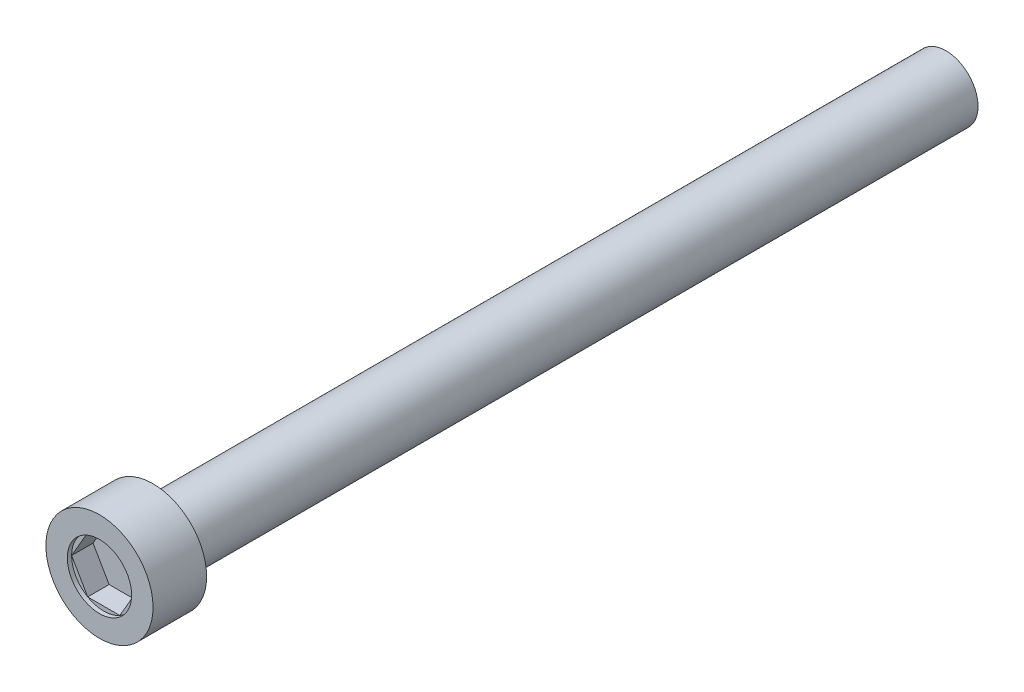
ISO-10303-21;
HEADER;
FILE_DESCRIPTION(('STEP AP214'),'2;1');
FILE_NAME('part.step','',(''),(''),'','','');
FILE_SCHEMA(('AUTOMOTIVE_DESIGN { 1 0 10303 214 1 1 1 1 }'));
ENDSEC;
DATA;
#1=APPLICATION_CONTEXT('core data for automotive mechanical design processes');
#2=APPLICATION_PROTOCOL_DEFINITION('international standard','automotive_design',2000,#1);
#3=PRODUCT_CONTEXT('',#1,'mechanical');
#4=PRODUCT('Part','Part','',(#3));
#5=PRODUCT_RELATED_PRODUCT_CATEGORY('part','',(#4));
#6=PRODUCT_DEFINITION_FORMATION('','',#4);
#7=PRODUCT_DEFINITION_CONTEXT('part definition',#1,'design');
#8=PRODUCT_DEFINITION('design','',#6,#7);
#9=PRODUCT_DEFINITION_SHAPE('','',#8);
#10=(LENGTH_UNIT() NAMED_UNIT(*) SI_UNIT(.MILLI.,.METRE.));
#11=(NAMED_UNIT(*) PLANE_ANGLE_UNIT() SI_UNIT($,.RADIAN.));
#12=(NAMED_UNIT(*) SI_UNIT($,.STERADIAN.) SOLID_ANGLE_UNIT());
#13=UNCERTAINTY_MEASURE_WITH_UNIT(LENGTH_MEASURE(1.E-05),#10,'distance_accuracy_value','');
#14=(GEOMETRIC_REPRESENTATION_CONTEXT(3) GLOBAL_UNCERTAINTY_ASSIGNED_CONTEXT((#13)) GLOBAL_UNIT_ASSIGNED_CONTEXT((#10,
#11,#12)) REPRESENTATION_CONTEXT('',''));
#15=CARTESIAN_POINT('',(0.,0.,0.));
#16=DIRECTION('',(0.,0.,1.));
#17=DIRECTION('',(1.,0.,0.));
#18=AXIS2_PLACEMENT_3D('',#15,#16,#17);
#19=CARTESIAN_POINT('',(0.,0.,1.3));
#20=DIRECTION('',(0.,0.,1.));
#21=DIRECTION('',(1.,0.,0.));
#22=AXIS2_PLACEMENT_3D('',#19,#20,#21);
#23=PLANE('',#22);
#24=DIRECTION('',(-0.5,-0.866025403784438,0.));
#25=VECTOR('',#24,1.);
#26=CARTESIAN_POINT('',(-0.749999999999999,1.29903810567666,1.3));
#27=LINE('',#26,#25);
#28=CARTESIAN_POINT('',(-0.749999999999999,1.29903810567666,1.3));
#29=VERTEX_POINT('',#28);
#30=CARTESIAN_POINT('',(-1.5,0.,1.3));
#31=VERTEX_POINT('',#30);
#32=EDGE_CURVE('E94',#29,#31,#27,.T.);
#33=ORIENTED_EDGE('',*,*,#32,.T.);
#34=DIRECTION('',(0.5,-0.866025403784439,0.));
#35=VECTOR('',#34,1.);
#36=CARTESIAN_POINT('',(-1.5,0.,1.3));
#37=LINE('',#36,#35);
#38=CARTESIAN_POINT('',(-0.75,-1.29903810567666,1.3));
#39=VERTEX_POINT('',#38);
#40=EDGE_CURVE('E157',#31,#39,#37,.T.);
#41=ORIENTED_EDGE('',*,*,#40,.T.);
#42=DIRECTION('',(1.,0.,0.));
#43=VECTOR('',#42,1.);
#44=CARTESIAN_POINT('',(-0.75,-1.29903810567666,1.3));
#45=LINE('',#44,#43);
#46=CARTESIAN_POINT('',(0.75,-1.29903810567666,1.3));
#47=VERTEX_POINT('',#46);
#48=EDGE_CURVE('E66',#39,#47,#45,.T.);
#49=ORIENTED_EDGE('',*,*,#48,.T.);
#50=DIRECTION('',(0.5,0.866025403784438,0.));
#51=VECTOR('',#50,1.);
#52=CARTESIAN_POINT('',(0.75,-1.29903810567666,1.3));
#53=LINE('',#52,#51);
#54=CARTESIAN_POINT('',(1.5,0.,1.3));
#55=VERTEX_POINT('',#54);
#56=EDGE_CURVE('E61',#47,#55,#53,.T.);
#57=ORIENTED_EDGE('',*,*,#56,.T.);
#58=DIRECTION('',(-0.5,0.866025403784439,0.));
#59=VECTOR('',#58,1.);
#60=CARTESIAN_POINT('',(1.5,0.,1.3));
#61=LINE('',#60,#59);
#62=CARTESIAN_POINT('',(0.750000000000001,1.29903810567666,1.3));
#63=VERTEX_POINT('',#62);
#64=EDGE_CURVE('E75',#55,#63,#61,.T.);
#65=ORIENTED_EDGE('',*,*,#64,.T.);
#66=DIRECTION('',(-1.,0.,0.));
#67=VECTOR('',#66,1.);
#68=CARTESIAN_POINT('',(0.750000000000001,1.29903810567666,1.3));
#69=LINE('',#68,#67);
#70=EDGE_CURVE('E78',#63,#29,#69,.T.);
#71=ORIENTED_EDGE('',*,*,#70,.T.);
#72=EDGE_LOOP('',(#33,#41,#49,#57,#65,#71));
#73=FACE_BOUND('',#72,.T.);
#74=ADVANCED_FACE('F16',(#73),#23,.T.);
#75=CARTESIAN_POINT('',(1.5,0.,1.3));
#76=DIRECTION('',(0.866025403784439,0.5,0.));
#77=DIRECTION('',(-0.5,0.866025403784439,0.));
#78=AXIS2_PLACEMENT_3D('',#75,#76,#77);
#79=PLANE('',#78);
#80=DIRECTION('',(0.,0.,1.));
#81=VECTOR('',#80,1.);
#82=CARTESIAN_POINT('',(0.750000000000001,1.29903810567666,1.3));
#83=LINE('',#82,#81);
#84=CARTESIAN_POINT('',(0.75,1.29903810567666,2.3));
#85=VERTEX_POINT('',#84);
#86=EDGE_CURVE('E80',#85,#63,#83,.F.);
#87=ORIENTED_EDGE('',*,*,#86,.T.);
#88=ORIENTED_EDGE('',*,*,#64,.F.);
#89=DIRECTION('',(0.,0.,1.));
#90=VECTOR('',#89,1.);
#91=CARTESIAN_POINT('',(1.5,0.,1.3));
#92=LINE('',#91,#90);
#93=CARTESIAN_POINT('',(1.5,0.,2.3));
#94=VERTEX_POINT('',#93);
#95=EDGE_CURVE('E53',#55,#94,#92,.T.);
#96=ORIENTED_EDGE('',*,*,#95,.T.);
#97=DIRECTION('',(0.499999999999999,-0.866025403784439,0.));
#98=VECTOR('',#97,1.);
#99=CARTESIAN_POINT('',(0.750000000000001,1.29903810567666,2.3));
#100=LINE('',#99,#98);
#101=EDGE_CURVE('E85',#85,#94,#100,.T.);
#102=ORIENTED_EDGE('',*,*,#101,.F.);
#103=EDGE_LOOP('',(#87,#88,#96,#102));
#104=FACE_BOUND('',#103,.T.);
#105=ADVANCED_FACE('F83',(#104),#79,.F.);
#106=CARTESIAN_POINT('',(0.750000000000001,1.29903810567666,1.3));
#107=DIRECTION('',(0.,1.,0.));
#108=DIRECTION('',(-1.,0.,0.));
#109=AXIS2_PLACEMENT_3D('',#106,#107,#108);
#110=PLANE('',#109);
#111=DIRECTION('',(0.,0.,1.));
#112=VECTOR('',#111,1.);
#113=CARTESIAN_POINT('',(-0.749999999999999,1.29903810567666,1.3));
#114=LINE('',#113,#112);
#115=CARTESIAN_POINT('',(-0.749999999999998,1.29903810567666,2.3));
#116=VERTEX_POINT('',#115);
#117=EDGE_CURVE('E91',#116,#29,#114,.F.);
#118=ORIENTED_EDGE('',*,*,#117,.T.);
#119=ORIENTED_EDGE('',*,*,#70,.F.);
#120=ORIENTED_EDGE('',*,*,#86,.F.);
#121=DIRECTION('',(1.,0.,0.));
#122=VECTOR('',#121,1.);
#123=CARTESIAN_POINT('',(0.,1.29903810567666,2.3));
#124=LINE('',#123,#122);
#125=EDGE_CURVE('E144',#116,#85,#124,.T.);
#126=ORIENTED_EDGE('',*,*,#125,.F.);
#127=EDGE_LOOP('',(#118,#119,#120,#126));
#128=FACE_BOUND('',#127,.T.);
#129=ADVANCED_FACE('F89',(#128),#110,.F.);
#130=CARTESIAN_POINT('',(-0.749999999999999,1.29903810567666,1.3));
#131=DIRECTION('',(-0.866025403784438,0.5,0.));
#132=DIRECTION('',(-0.5,-0.866025403784438,0.));
#133=AXIS2_PLACEMENT_3D('',#130,#131,#132);
#134=PLANE('',#133);
#135=DIRECTION('',(0.,0.,1.));
#136=VECTOR('',#135,1.);
#137=CARTESIAN_POINT('',(-1.5,0.,1.3));
#138=LINE('',#137,#136);
#139=CARTESIAN_POINT('',(-1.5,0.,2.3));
#140=VERTEX_POINT('',#139);
#141=EDGE_CURVE('E160',#140,#31,#138,.F.);
#142=ORIENTED_EDGE('',*,*,#141,.T.);
#143=ORIENTED_EDGE('',*,*,#32,.F.);
#144=ORIENTED_EDGE('',*,*,#117,.F.);
#145=DIRECTION('',(0.5,0.866025403784439,0.));
#146=VECTOR('',#145,1.);
#147=CARTESIAN_POINT('',(-1.5,0.,2.3));
#148=LINE('',#147,#146);
#149=EDGE_CURVE('E142',#140,#116,#148,.T.);
#150=ORIENTED_EDGE('',*,*,#149,.F.);
#151=EDGE_LOOP('',(#142,#143,#144,#150));
#152=FACE_BOUND('',#151,.T.);
#153=ADVANCED_FACE('F182',(#152),#134,.F.);
#154=CARTESIAN_POINT('',(-1.5,0.,1.3));
#155=DIRECTION('',(-0.866025403784439,-0.5,0.));
#156=DIRECTION('',(0.5,-0.866025403784439,0.));
#157=AXIS2_PLACEMENT_3D('',#154,#155,#156);
#158=PLANE('',#157);
#159=DIRECTION('',(0.,0.,1.));
#160=VECTOR('',#159,1.);
#161=CARTESIAN_POINT('',(-0.75,-1.29903810567666,1.3));
#162=LINE('',#161,#160);
#163=CARTESIAN_POINT('',(-0.749999999999999,-1.29903810567666,2.3));
#164=VERTEX_POINT('',#163);
#165=EDGE_CURVE('E154',#164,#39,#162,.F.);
#166=ORIENTED_EDGE('',*,*,#165,.T.);
#167=ORIENTED_EDGE('',*,*,#40,.F.);
#168=ORIENTED_EDGE('',*,*,#141,.F.);
#169=DIRECTION('',(-0.499999999999999,0.866025403784439,0.));
#170=VECTOR('',#169,1.);
#171=CARTESIAN_POINT('',(-0.75,-1.29903810567666,2.3));
#172=LINE('',#171,#170);
#173=EDGE_CURVE('E137',#164,#140,#172,.T.);
#174=ORIENTED_EDGE('',*,*,#173,.F.);
#175=EDGE_LOOP('',(#166,#167,#168,#174));
#176=FACE_BOUND('',#175,.T.);
#177=ADVANCED_FACE('F184',(#176),#158,.F.);
#178=CARTESIAN_POINT('',(-0.75,-1.29903810567666,1.3));
#179=DIRECTION('',(0.,-1.,0.));
#180=DIRECTION('',(1.,0.,0.));
#181=AXIS2_PLACEMENT_3D('',#178,#179,#180);
#182=PLANE('',#181);
#183=DIRECTION('',(0.,0.,1.));
#184=VECTOR('',#183,1.);
#185=CARTESIAN_POINT('',(0.75,-1.29903810567666,1.3));
#186=LINE('',#185,#184);
#187=CARTESIAN_POINT('',(0.749999999999999,-1.29903810567666,2.3));
#188=VERTEX_POINT('',#187);
#189=EDGE_CURVE('E150',#188,#47,#186,.F.);
#190=ORIENTED_EDGE('',*,*,#189,.T.);
#191=ORIENTED_EDGE('',*,*,#48,.F.);
#192=ORIENTED_EDGE('',*,*,#165,.F.);
#193=DIRECTION('',(1.,0.,0.));
#194=VECTOR('',#193,1.);
#195=CARTESIAN_POINT('',(0.,-1.29903810567666,2.3));
#196=LINE('',#195,#194);
#197=EDGE_CURVE('E34',#188,#164,#196,.F.);
#198=ORIENTED_EDGE('',*,*,#197,.F.);
#199=EDGE_LOOP('',(#190,#191,#192,#198));
#200=FACE_BOUND('',#199,.T.);
#201=ADVANCED_FACE('F185',(#200),#182,.F.);
#202=CARTESIAN_POINT('',(0.75,-1.29903810567666,1.3));
#203=DIRECTION('',(0.866025403784438,-0.5,0.));
#204=DIRECTION('',(0.5,0.866025403784438,0.));
#205=AXIS2_PLACEMENT_3D('',#202,#203,#204);
#206=PLANE('',#205);
#207=ORIENTED_EDGE('',*,*,#95,.F.);
#208=ORIENTED_EDGE('',*,*,#56,.F.);
#209=ORIENTED_EDGE('',*,*,#189,.F.);
#210=DIRECTION('',(-0.5,-0.866025403784439,0.));
#211=VECTOR('',#210,1.);
#212=CARTESIAN_POINT('',(1.5,0.,2.3));
#213=LINE('',#212,#211);
#214=EDGE_CURVE('E130',#94,#188,#213,.T.);
#215=ORIENTED_EDGE('',*,*,#214,.F.);
#216=EDGE_LOOP('',(#207,#208,#209,#215));
#217=FACE_BOUND('',#216,.T.);
#218=ADVANCED_FACE('F187',(#217),#206,.F.);
#219=CARTESIAN_POINT('',(0.,0.,2.3));
#220=DIRECTION('',(0.,0.,1.));
#221=DIRECTION('',(1.,0.,0.));
#222=AXIS2_PLACEMENT_3D('',#219,#220,#221);
#223=PLANE('',#222);
#224=ORIENTED_EDGE('',*,*,#101,.T.);
#225=CARTESIAN_POINT('',(0.,0.,2.3));
#226=DIRECTION('',(0.,0.,1.));
#227=DIRECTION('',(1.,0.,0.));
#228=AXIS2_PLACEMENT_3D('',#225,#226,#227);
#229=CIRCLE('',#228,1.5);
#230=EDGE_CURVE('E19',#94,#85,#229,.T.);
#231=ORIENTED_EDGE('',*,*,#230,.T.);
#232=EDGE_LOOP('',(#224,#231));
#233=FACE_BOUND('',#232,.T.);
#234=ADVANCED_FACE('F188',(#233),#223,.T.);
#235=CARTESIAN_POINT('',(0.,0.,2.3));
#236=DIRECTION('',(0.,0.,1.));
#237=DIRECTION('',(1.,0.,0.));
#238=AXIS2_PLACEMENT_3D('',#235,#236,#237);
#239=PLANE('',#238);
#240=ORIENTED_EDGE('',*,*,#125,.T.);
#241=CARTESIAN_POINT('',(0.,0.,2.3));
#242=DIRECTION('',(0.,0.,1.));
#243=DIRECTION('',(1.,0.,0.));
#244=AXIS2_PLACEMENT_3D('',#241,#242,#243);
#245=CIRCLE('',#244,1.5);
#246=EDGE_CURVE('E124',#85,#116,#245,.T.);
#247=ORIENTED_EDGE('',*,*,#246,.T.);
#248=EDGE_LOOP('',(#240,#247));
#249=FACE_BOUND('',#248,.T.);
#250=ADVANCED_FACE('F302',(#249),#239,.T.);
#251=CARTESIAN_POINT('',(0.,0.,2.3));
#252=DIRECTION('',(0.,0.,1.));
#253=DIRECTION('',(1.,0.,0.));
#254=AXIS2_PLACEMENT_3D('',#251,#252,#253);
#255=PLANE('',#254);
#256=ORIENTED_EDGE('',*,*,#149,.T.);
#257=CARTESIAN_POINT('',(0.,0.,2.3));
#258=DIRECTION('',(0.,0.,1.));
#259=DIRECTION('',(1.,0.,0.));
#260=AXIS2_PLACEMENT_3D('',#257,#258,#259);
#261=CIRCLE('',#260,1.5);
#262=EDGE_CURVE('E122',#116,#140,#261,.T.);
#263=ORIENTED_EDGE('',*,*,#262,.T.);
#264=EDGE_LOOP('',(#256,#263));
#265=FACE_BOUND('',#264,.T.);
#266=ADVANCED_FACE('F196',(#265),#255,.T.);
#267=CARTESIAN_POINT('',(0.,0.,2.3));
#268=DIRECTION('',(0.,0.,1.));
#269=DIRECTION('',(1.,0.,0.));
#270=AXIS2_PLACEMENT_3D('',#267,#268,#269);
#271=PLANE('',#270);
#272=ORIENTED_EDGE('',*,*,#173,.T.);
#273=CARTESIAN_POINT('',(0.,0.,2.3));
#274=DIRECTION('',(0.,0.,1.));
#275=DIRECTION('',(1.,0.,0.));
#276=AXIS2_PLACEMENT_3D('',#273,#274,#275);
#277=CIRCLE('',#276,1.5);
#278=EDGE_CURVE('E119',#140,#164,#277,.T.);
#279=ORIENTED_EDGE('',*,*,#278,.T.);
#280=EDGE_LOOP('',(#272,#279));
#281=FACE_BOUND('',#280,.T.);
#282=ADVANCED_FACE('F198',(#281),#271,.T.);
#283=CARTESIAN_POINT('',(0.,0.,2.3));
#284=DIRECTION('',(0.,0.,1.));
#285=DIRECTION('',(1.,0.,0.));
#286=AXIS2_PLACEMENT_3D('',#283,#284,#285);
#287=PLANE('',#286);
#288=ORIENTED_EDGE('',*,*,#197,.T.);
#289=CARTESIAN_POINT('',(0.,0.,2.3));
#290=DIRECTION('',(0.,0.,1.));
#291=DIRECTION('',(1.,0.,0.));
#292=AXIS2_PLACEMENT_3D('',#289,#290,#291);
#293=CIRCLE('',#292,1.5);
#294=EDGE_CURVE('E116',#164,#188,#293,.T.);
#295=ORIENTED_EDGE('',*,*,#294,.T.);
#296=EDGE_LOOP('',(#288,#295));
#297=FACE_BOUND('',#296,.T.);
#298=ADVANCED_FACE('F200',(#297),#287,.T.);
#299=CARTESIAN_POINT('',(0.,0.,2.3));
#300=DIRECTION('',(0.,0.,1.));
#301=DIRECTION('',(1.,0.,0.));
#302=AXIS2_PLACEMENT_3D('',#299,#300,#301);
#303=PLANE('',#302);
#304=ORIENTED_EDGE('',*,*,#214,.T.);
#305=CARTESIAN_POINT('',(0.,0.,2.3));
#306=DIRECTION('',(0.,0.,1.));
#307=DIRECTION('',(1.,0.,0.));
#308=AXIS2_PLACEMENT_3D('',#305,#306,#307);
#309=CIRCLE('',#308,1.5);
#310=EDGE_CURVE('E113',#188,#94,#309,.T.);
#311=ORIENTED_EDGE('',*,*,#310,.T.);
#312=EDGE_LOOP('',(#304,#311));
#313=FACE_BOUND('',#312,.T.);
#314=ADVANCED_FACE('F189',(#313),#303,.T.);
#315=CARTESIAN_POINT('',(0.,0.,2.3));
#316=DIRECTION('',(0.,0.,1.));
#317=DIRECTION('',(1.,0.,0.));
#318=AXIS2_PLACEMENT_3D('',#315,#316,#317);
#319=CYLINDRICAL_SURFACE('',#318,1.5);
#320=CARTESIAN_POINT('',(0.,0.,2.5));
#321=DIRECTION('',(0.,0.,1.));
#322=DIRECTION('',(1.,0.,0.));
#323=AXIS2_PLACEMENT_3D('',#320,#321,#322);
#324=CIRCLE('',#323,1.5);
#325=CARTESIAN_POINT('',(1.5,0.,2.5));
#326=VERTEX_POINT('',#325);
#327=EDGE_CURVE('E110',#326,#326,#324,.F.);
#328=ORIENTED_EDGE('',*,*,#327,.F.);
#329=EDGE_LOOP('',(#328));
#330=FACE_BOUND('',#329,.T.);
#331=ORIENTED_EDGE('',*,*,#294,.F.);
#332=ORIENTED_EDGE('',*,*,#278,.F.);
#333=ORIENTED_EDGE('',*,*,#262,.F.);
#334=ORIENTED_EDGE('',*,*,#246,.F.);
#335=ORIENTED_EDGE('',*,*,#230,.F.);
#336=ORIENTED_EDGE('',*,*,#310,.F.);
#337=EDGE_LOOP('',(#331,#332,#333,#334,#335,#336));
#338=FACE_BOUND('',#337,.T.);
#339=ADVANCED_FACE('F192',(#330,#338),#319,.F.);
#340=CARTESIAN_POINT('',(0.,0.,2.5));
#341=DIRECTION('',(0.,0.,1.));
#342=DIRECTION('',(1.,0.,0.));
#343=AXIS2_PLACEMENT_3D('',#340,#341,#342);
#344=PLANE('',#343);
#345=ORIENTED_EDGE('',*,*,#327,.T.);
#346=EDGE_LOOP('',(#345));
#347=FACE_BOUND('',#346,.T.);
#348=CARTESIAN_POINT('',(0.,0.,2.5));
#349=DIRECTION('',(0.,0.,1.));
#350=DIRECTION('',(1.,0.,0.));
#351=AXIS2_PLACEMENT_3D('',#348,#349,#350);
#352=CIRCLE('',#351,2.5);
#353=CARTESIAN_POINT('',(2.5,0.,2.5));
#354=VERTEX_POINT('',#353);
#355=EDGE_CURVE('E107',#354,#354,#352,.F.);
#356=ORIENTED_EDGE('',*,*,#355,.F.);
#357=EDGE_LOOP('',(#356));
#358=FACE_BOUND('',#357,.T.);
#359=ADVANCED_FACE('F229',(#347,#358),#344,.T.);
#360=CARTESIAN_POINT('',(0.,0.,0.));
#361=DIRECTION('',(0.,0.,1.));
#362=DIRECTION('',(1.,0.,0.));
#363=AXIS2_PLACEMENT_3D('',#360,#361,#362);
#364=CYLINDRICAL_SURFACE('',#363,2.5);
#365=CARTESIAN_POINT('',(0.,0.,0.));
#366=DIRECTION('',(0.,0.,1.));
#367=DIRECTION('',(1.,0.,0.));
#368=AXIS2_PLACEMENT_3D('',#365,#366,#367);
#369=CIRCLE('',#368,2.5);
#370=CARTESIAN_POINT('',(2.5,0.,0.));
#371=VERTEX_POINT('',#370);
#372=EDGE_CURVE('E104',#371,#371,#369,.T.);
#373=ORIENTED_EDGE('',*,*,#372,.T.);
#374=EDGE_LOOP('',(#373));
#375=FACE_BOUND('',#374,.T.);
#376=ORIENTED_EDGE('',*,*,#355,.T.);
#377=EDGE_LOOP('',(#376));
#378=FACE_BOUND('',#377,.T.);
#379=ADVANCED_FACE('F225',(#375,#378),#364,.T.);
#380=CARTESIAN_POINT('',(0.,0.,0.));
#381=DIRECTION('',(0.,0.,1.));
#382=DIRECTION('',(1.,0.,0.));
#383=AXIS2_PLACEMENT_3D('',#380,#381,#382);
#384=PLANE('',#383);
#385=CARTESIAN_POINT('',(0.,0.,0.));
#386=DIRECTION('',(0.,0.,-1.));
#387=DIRECTION('',(-1.,0.,0.));
#388=AXIS2_PLACEMENT_3D('',#385,#386,#387);
#389=CIRCLE('',#388,1.5);
#390=CARTESIAN_POINT('',(-1.5,0.,0.));
#391=VERTEX_POINT('',#390);
#392=EDGE_CURVE('E25',#391,#391,#389,.T.);
#393=ORIENTED_EDGE('',*,*,#392,.F.);
#394=EDGE_LOOP('',(#393));
#395=FACE_BOUND('',#394,.T.);
#396=ORIENTED_EDGE('',*,*,#372,.F.);
#397=EDGE_LOOP('',(#396));
#398=FACE_BOUND('',#397,.T.);
#399=ADVANCED_FACE('F218',(#395,#398),#384,.F.);
#400=CARTESIAN_POINT('',(0.,0.,-37.));
#401=DIRECTION('',(0.,0.,-1.));
#402=DIRECTION('',(-1.,0.,0.));
#403=AXIS2_PLACEMENT_3D('',#400,#401,#402);
#404=PLANE('',#403);
#405=CARTESIAN_POINT('',(0.,0.,-37.));
#406=DIRECTION('',(0.,0.,-1.));
#407=DIRECTION('',(-1.,0.,0.));
#408=AXIS2_PLACEMENT_3D('',#405,#406,#407);
#409=CIRCLE('',#408,1.5);
#410=CARTESIAN_POINT('',(-1.5,0.,-37.));
#411=VERTEX_POINT('',#410);
#412=EDGE_CURVE('E11',#411,#411,#409,.F.);
#413=ORIENTED_EDGE('',*,*,#412,.F.);
#414=EDGE_LOOP('',(#413));
#415=FACE_BOUND('',#414,.T.);
#416=ADVANCED_FACE('F212',(#415),#404,.T.);
#417=CARTESIAN_POINT('',(0.,0.,0.));
#418=DIRECTION('',(0.,0.,-1.));
#419=DIRECTION('',(-1.,0.,0.));
#420=AXIS2_PLACEMENT_3D('',#417,#418,#419);
#421=CYLINDRICAL_SURFACE('',#420,1.5);
#422=ORIENTED_EDGE('',*,*,#412,.T.);
#423=EDGE_LOOP('',(#422));
#424=FACE_BOUND('',#423,.T.);
#425=ORIENTED_EDGE('',*,*,#392,.T.);
#426=EDGE_LOOP('',(#425));
#427=FACE_BOUND('',#426,.T.);
#428=ADVANCED_FACE('F210',(#424,#427),#421,.T.);
#429=CLOSED_SHELL('',(#74,#105,#129,#153,#177,#201,#218,#234,#250,#266,#282,#298,#314,#339,#359,
#379,#399,#416,#428));
#430=MANIFOLD_SOLID_BREP('B1',#429);
#431=ADVANCED_BREP_SHAPE_REPRESENTATION('',(#18,#430),#14);
#432=SHAPE_DEFINITION_REPRESENTATION(#9,#431);
ENDSEC;
END-ISO-10303-21;
